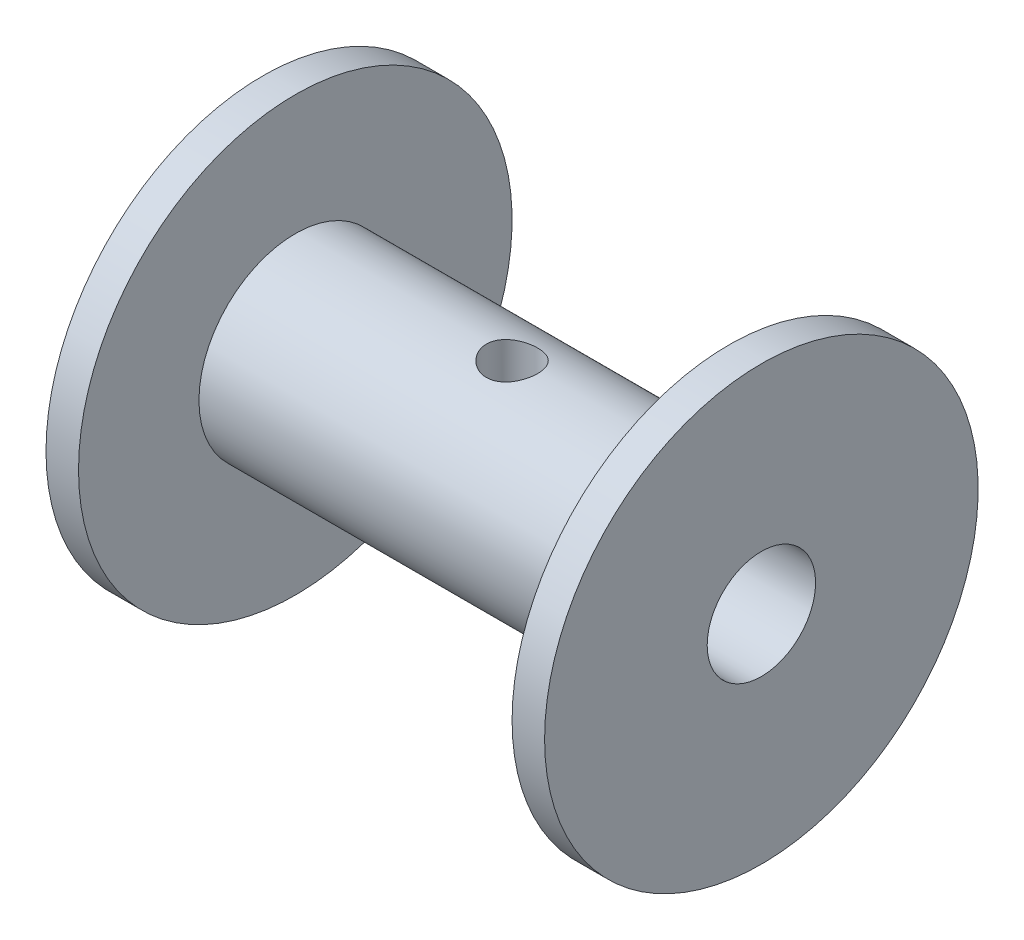
ISO-10303-21;
HEADER;
FILE_DESCRIPTION(('STEP AP214'),'2;1');
FILE_NAME('part.step','',(''),(''),'','','');
FILE_SCHEMA(('AUTOMOTIVE_DESIGN { 1 0 10303 214 1 1 1 1 }'));
ENDSEC;
DATA;
#1=APPLICATION_CONTEXT('core data for automotive mechanical design processes');
#2=APPLICATION_PROTOCOL_DEFINITION('international standard','automotive_design',2000,#1);
#3=PRODUCT_CONTEXT('',#1,'mechanical');
#4=PRODUCT('Part','Part','',(#3));
#5=PRODUCT_RELATED_PRODUCT_CATEGORY('part','',(#4));
#6=PRODUCT_DEFINITION_FORMATION('','',#4);
#7=PRODUCT_DEFINITION_CONTEXT('part definition',#1,'design');
#8=PRODUCT_DEFINITION('design','',#6,#7);
#9=PRODUCT_DEFINITION_SHAPE('','',#8);
#10=(LENGTH_UNIT() NAMED_UNIT(*) SI_UNIT(.MILLI.,.METRE.));
#11=(NAMED_UNIT(*) PLANE_ANGLE_UNIT() SI_UNIT($,.RADIAN.));
#12=(NAMED_UNIT(*) SI_UNIT($,.STERADIAN.) SOLID_ANGLE_UNIT());
#13=UNCERTAINTY_MEASURE_WITH_UNIT(LENGTH_MEASURE(1.E-05),#10,'distance_accuracy_value','');
#14=(GEOMETRIC_REPRESENTATION_CONTEXT(3) GLOBAL_UNCERTAINTY_ASSIGNED_CONTEXT((#13)) GLOBAL_UNIT_ASSIGNED_CONTEXT((#10,
#11,#12)) REPRESENTATION_CONTEXT('',''));
#15=CARTESIAN_POINT('',(0.,0.,0.));
#16=DIRECTION('',(0.,0.,1.));
#17=DIRECTION('',(1.,0.,0.));
#18=AXIS2_PLACEMENT_3D('',#15,#16,#17);
#19=CARTESIAN_POINT('',(-15.2755244755245,0.,0.));
#20=DIRECTION('',(-1.,0.,0.));
#21=DIRECTION('',(0.,0.,1.));
#22=AXIS2_PLACEMENT_3D('',#19,#20,#21);
#23=CYLINDRICAL_SURFACE('',#22,3.175);
#24=CARTESIAN_POINT('',(14.605,0.,0.));
#25=DIRECTION('',(-1.,0.,0.));
#26=DIRECTION('',(0.,0.,1.));
#27=AXIS2_PLACEMENT_3D('',#24,#25,#26);
#28=CIRCLE('',#27,3.175);
#29=CARTESIAN_POINT('',(14.605,0.,3.175));
#30=VERTEX_POINT('',#29);
#31=EDGE_CURVE('E78',#30,#30,#28,.T.);
#32=ORIENTED_EDGE('',*,*,#31,.F.);
#33=EDGE_LOOP('',(#32));
#34=FACE_BOUND('',#33,.T.);
#35=CARTESIAN_POINT('',(-14.605,0.,0.));
#36=DIRECTION('',(-1.,0.,0.));
#37=DIRECTION('',(0.,0.,1.));
#38=AXIS2_PLACEMENT_3D('',#35,#36,#37);
#39=CIRCLE('',#38,3.175);
#40=CARTESIAN_POINT('',(-14.605,0.,3.175));
#41=VERTEX_POINT('',#40);
#42=EDGE_CURVE('E72',#41,#41,#39,.T.);
#43=ORIENTED_EDGE('',*,*,#42,.T.);
#44=EDGE_LOOP('',(#43));
#45=FACE_BOUND('',#44,.T.);
#46=CARTESIAN_POINT('',(0.,2.7983253920872,-1.5));
#47=CARTESIAN_POINT('',(0.0788107476010318,2.79833097649977,-1.49999523547047));
#48=CARTESIAN_POINT('',(0.157735612205732,2.80170427159323,-1.49374832449328));
#49=CARTESIAN_POINT('',(0.313214667514685,2.81472644561665,-1.4690554061353));
#50=CARTESIAN_POINT('',(0.389762907162895,2.82438992585351,-1.45058101361493));
#51=CARTESIAN_POINT('',(0.537952673756734,2.84863009396432,-1.40237253355636));
#52=CARTESIAN_POINT('',(0.609616136431819,2.86318279906116,-1.37269332197988));
#53=CARTESIAN_POINT('',(0.74692939284759,2.89552502377023,-1.30308399064542));
#54=CARTESIAN_POINT('',(0.812579442278901,2.91331440566267,-1.26315430701281));
#55=CARTESIAN_POINT('',(0.941323245258399,2.95172227722859,-1.1707430871524));
#56=CARTESIAN_POINT('',(1.00387788849068,2.97245254188493,-1.11755658650795));
#57=CARTESIAN_POINT('',(1.11959143684936,3.01349951044786,-1.00161259672221));
#58=CARTESIAN_POINT('',(1.17274606260041,3.03381602228766,-0.938850772491943));
#59=CARTESIAN_POINT('',(1.27118937954777,3.07317288716969,-0.801034900704513));
#60=CARTESIAN_POINT('',(1.31583450125175,3.09206866660246,-0.725476017233362));
#61=CARTESIAN_POINT('',(1.39153752206176,3.12503381595021,-0.566861686619153));
#62=CARTESIAN_POINT('',(1.42260309774527,3.13910591174128,-0.483810507023547));
#63=CARTESIAN_POINT('',(1.46819431985617,3.16003750546179,-0.318263833167131));
#64=CARTESIAN_POINT('',(1.4836598006004,3.16730464125021,-0.236079837596818));
#65=CARTESIAN_POINT('',(1.50068669846295,3.17531500926786,-0.0699854874354057));
#66=CARTESIAN_POINT('',(1.50225551712034,3.17606171435844,0.0139239243031304));
#67=CARTESIAN_POINT('',(1.49185310738046,3.1711569999128,0.174104046955922));
#68=CARTESIAN_POINT('',(1.4809263684281,3.16599910390162,0.25046092630755));
#69=CARTESIAN_POINT('',(1.44768451199485,3.15058713309443,0.400106757592314));
#70=CARTESIAN_POINT('',(1.42536854800002,3.14033267949386,0.473395481043945));
#71=CARTESIAN_POINT('',(1.36978180811971,3.11549383971164,0.616162159992471));
#72=CARTESIAN_POINT('',(1.33635400002596,3.10084769916082,0.685567785451938));
#73=CARTESIAN_POINT('',(1.25968096352203,3.06858481389696,0.817962218284119));
#74=CARTESIAN_POINT('',(1.21643213988174,3.05096698193041,0.880948663490017));
#75=CARTESIAN_POINT('',(1.11701776567009,3.01265189942243,1.00453666893054));
#76=CARTESIAN_POINT('',(1.06005736803148,2.9918200943109,1.06445784147851));
#77=CARTESIAN_POINT('',(0.93699705964444,2.95046283361779,1.17424124933889));
#78=CARTESIAN_POINT('',(0.87089145595116,2.92993757775203,1.2240971710571));
#79=CARTESIAN_POINT('',(0.727172138151077,2.89039711066438,1.31484174230845));
#80=CARTESIAN_POINT('',(0.649138941996297,2.87151577260243,1.35512986365461));
#81=CARTESIAN_POINT('',(0.48628374353103,2.83914834140001,1.42170562946273));
#82=CARTESIAN_POINT('',(0.401468219875631,2.82565717160027,1.44800645544408));
#83=CARTESIAN_POINT('',(0.234253704737597,2.80697974613979,1.48387059914899));
#84=CARTESIAN_POINT('',(0.152157558069844,2.80124227464673,1.4945499135996));
#85=CARTESIAN_POINT('',(-0.0128364544628814,2.79714234532468,1.50221328025957));
#86=CARTESIAN_POINT('',(-0.0957338532268699,2.79877582206013,1.49920488189903));
#87=CARTESIAN_POINT('',(-0.251841101180711,2.80865284380239,1.4806017347564));
#88=CARTESIAN_POINT('',(-0.325238133539681,2.81627144126264,1.46619608896935));
#89=CARTESIAN_POINT('',(-0.468463633051389,2.83637948512089,1.42690562153975));
#90=CARTESIAN_POINT('',(-0.538291075738514,2.8488703210638,1.40201781025962));
#91=CARTESIAN_POINT('',(-0.676035807524976,2.87800314814948,1.3412324594274));
#92=CARTESIAN_POINT('',(-0.743715994140067,2.89481019393091,1.30487958898417));
#93=CARTESIAN_POINT('',(-0.872389828600746,2.93050507850425,1.22260967416881));
#94=CARTESIAN_POINT('',(-0.933380117805991,2.94939395301752,1.17668785898318));
#95=CARTESIAN_POINT('',(-1.05395122429284,2.98962533435876,1.07066250220429));
#96=CARTESIAN_POINT('',(-1.11263900919066,3.0110091844446,1.00955462247668));
#97=CARTESIAN_POINT('',(-1.2191662131219,3.05197816465585,0.877952835832724));
#98=CARTESIAN_POINT('',(-1.2670031388463,3.07156288076261,0.807456777596011));
#99=CARTESIAN_POINT('',(-1.35106340432696,3.10717258491727,0.657374049291594));
#100=CARTESIAN_POINT('',(-1.38708244177874,3.12313361565429,0.577656753882325));
#101=CARTESIAN_POINT('',(-1.44486593502356,3.14922093597641,0.412327293299581));
#102=CARTESIAN_POINT('',(-1.46664154231209,3.15935178938716,0.326719797872877));
#103=CARTESIAN_POINT('',(-1.49363889435459,3.17197971044583,0.159896332874222));
#104=CARTESIAN_POINT('',(-1.50011013632642,3.17505233840112,0.0789253982840775));
#105=CARTESIAN_POINT('',(-1.49988711965684,3.17494636529876,-0.0829833461657179));
#106=CARTESIAN_POINT('',(-1.49319653511093,3.17176950877122,-0.163921158963005));
#107=CARTESIAN_POINT('',(-1.46770848023088,3.15985410378094,-0.318841842835548));
#108=CARTESIAN_POINT('',(-1.44959197491994,3.15142868675494,-0.392963167600615));
#109=CARTESIAN_POINT('',(-1.40262108547478,3.13010132928976,-0.537026434022491));
#110=CARTESIAN_POINT('',(-1.37376499240882,3.1171986764347,-0.60696770847403));
#111=CARTESIAN_POINT('',(-1.30473490189286,3.08738510301285,-0.744198443618439));
#112=CARTESIAN_POINT('',(-1.26410939390821,3.0703197298679,-0.811226286131094));
#113=CARTESIAN_POINT('',(-1.17328432091972,3.03405477724481,-0.937805412907553));
#114=CARTESIAN_POINT('',(-1.12308040855481,3.01485423033003,-0.997353281796323));
#115=CARTESIAN_POINT('',(-1.00928446778082,2.97425749382228,-1.11287613406119));
#116=CARTESIAN_POINT('',(-0.944896373173603,2.9528185885393,-1.16805442942683));
#117=CARTESIAN_POINT('',(-0.807312145748489,2.91171333700677,-1.26705651381277));
#118=CARTESIAN_POINT('',(-0.734109598744511,2.89204830000693,-1.31087196019013));
#119=CARTESIAN_POINT('',(-0.579232422210802,2.85663554941127,-1.3863737982034));
#120=CARTESIAN_POINT('',(-0.497439352525226,2.84095675906997,-1.41785130272302));
#121=CARTESIAN_POINT('',(-0.328811998329219,2.81635628214136,-1.4661232120466));
#122=CARTESIAN_POINT('',(-0.241995696672077,2.80741192483264,-1.48296690968124));
#123=CARTESIAN_POINT('',(-0.128694633247988,2.80116429672363,-1.49469268672873));
#124=CARTESIAN_POINT('',(-0.10301180774758,2.80010260103933,-1.49668048940514));
#125=CARTESIAN_POINT('',(-0.0515567295081783,2.79868221732461,-1.49933495903092));
#126=CARTESIAN_POINT('',(-0.0257844722890938,2.79832356503778,-1.50000155880871));
#127=CARTESIAN_POINT('',(0.,2.7983253920872,-1.5));
#128=B_SPLINE_CURVE_WITH_KNOTS('',3,(#46,#47,#48,#49,#50,#51,#52,#53,#54,#55,#56,#57,#58,#59,
#60,#61,#62,#63,#64,#65,#66,#67,#68,#69,#70,#71,#72,#73,#74,#75,#76,#77,#78,#79,#80,#81,#82,#83,
#84,#85,#86,#87,#88,#89,#90,#91,#92,#93,#94,#95,#96,#97,#98,#99,#100,#101,#102,#103,#104,#105,
#106,#107,#108,#109,#110,#111,#112,#113,#114,#115,#116,#117,#118,#119,#120,#121,#122,#123,#124,
#125,#126,#127),.UNSPECIFIED.,.T.,.F.,(4,2,2,2,2,2,2,2,2,2,2,2,2,2,2,2,2,2,2,2,2,2,2,2,2,2,2,2,
2,2,2,2,2,2,2,2,2,2,2,2,4),(0.,0.236323871838544,0.473198284289303,0.7089273373807,
0.944646362603917,1.19762429635865,1.45071710395355,1.71864285343499,1.98641694681216,
2.23687152724757,2.48719270436037,2.71802817018661,2.94888079555675,3.18314531005561,
3.41749572162706,3.67216706074964,3.92699765369088,4.19506898546716,4.4628872392048,
4.71043828617548,4.95785281342715,5.18239796950746,5.40700721193729,5.64198832122139,
5.87708686716683,6.13804637958085,6.39906579463174,6.66438519401193,6.92949661955738,
7.17207877892644,7.41459323161728,7.64386670961211,7.87317668624822,8.11282240294707,
8.3525771477832,8.61378861881716,8.87519133270405,9.14084608292566,9.40560248746477,
9.48291651801969,9.56023447921351),.UNSPECIFIED.);
#129=CARTESIAN_POINT('',(0.,2.7983253920872,-1.5));
#130=VERTEX_POINT('',#129);
#131=EDGE_CURVE('E98',#130,#130,#128,.T.);
#132=ORIENTED_EDGE('',*,*,#131,.F.);
#133=EDGE_LOOP('',(#132));
#134=FACE_BOUND('',#133,.T.);
#135=ADVANCED_FACE('F53',(#34,#45,#134),#23,.F.);
#136=CARTESIAN_POINT('',(-15.2755244755245,0.,0.));
#137=DIRECTION('',(-1.,0.,0.));
#138=DIRECTION('',(0.,0.,1.));
#139=AXIS2_PLACEMENT_3D('',#136,#137,#138);
#140=CYLINDRICAL_SURFACE('',#139,5.64515);
#141=CARTESIAN_POINT('',(-12.7,0.,0.));
#142=DIRECTION('',(-1.,0.,0.));
#143=DIRECTION('',(0.,0.,1.));
#144=AXIS2_PLACEMENT_3D('',#141,#142,#143);
#145=CIRCLE('',#144,5.64515);
#146=CARTESIAN_POINT('',(-12.7,0.,5.64515));
#147=VERTEX_POINT('',#146);
#148=EDGE_CURVE('E94',#147,#147,#145,.T.);
#149=ORIENTED_EDGE('',*,*,#148,.F.);
#150=EDGE_LOOP('',(#149));
#151=FACE_BOUND('',#150,.T.);
#152=CARTESIAN_POINT('',(12.7,0.,0.));
#153=DIRECTION('',(-1.,0.,0.));
#154=DIRECTION('',(0.,0.,1.));
#155=AXIS2_PLACEMENT_3D('',#152,#153,#154);
#156=CIRCLE('',#155,5.64515);
#157=CARTESIAN_POINT('',(12.7,0.,5.64515));
#158=VERTEX_POINT('',#157);
#159=EDGE_CURVE('E90',#158,#158,#156,.T.);
#160=ORIENTED_EDGE('',*,*,#159,.T.);
#161=EDGE_LOOP('',(#160));
#162=FACE_BOUND('',#161,.T.);
#163=CARTESIAN_POINT('',(0.,5.44221632448583,-1.5));
#164=CARTESIAN_POINT('',(0.0826436498905731,5.44221776734982,-1.49999798482397));
#165=CARTESIAN_POINT('',(0.16530868542223,5.44411939956257,-1.49314675929322));
#166=CARTESIAN_POINT('',(0.328252175478541,5.45149790283637,-1.46597434045337));
#167=CARTESIAN_POINT('',(0.40852940000449,5.45697658425119,-1.4456463264267));
#168=CARTESIAN_POINT('',(0.564316549846696,5.47084585840447,-1.39223506110244));
#169=CARTESIAN_POINT('',(0.639832974686705,5.4792323749097,-1.35916965804295));
#170=CARTESIAN_POINT('',(0.784258298044925,5.49796717883473,-1.28127804023893));
#171=CARTESIAN_POINT('',(0.853166696174541,5.50831561464326,-1.23645093580583));
#172=CARTESIAN_POINT('',(0.984131351122835,5.53009622169304,-1.13511800376794));
#173=CARTESIAN_POINT('',(1.045999199762,5.54154749766791,-1.0783727299323));
#174=CARTESIAN_POINT('',(1.15946134412678,5.56407856754538,-0.955329261397279));
#175=CARTESIAN_POINT('',(1.21105458106165,5.57515832306535,-0.889030083387622));
#176=CARTESIAN_POINT('',(1.30328774666803,5.59591104111497,-0.747455285881687));
#177=CARTESIAN_POINT('',(1.34374049853005,5.6055588379263,-0.672053715192327));
#178=CARTESIAN_POINT('',(1.41132390215023,5.62214145846994,-0.515220536696469));
#179=CARTESIAN_POINT('',(1.43845678369634,5.62907673624688,-0.433789940796048));
#180=CARTESIAN_POINT('',(1.47802084117912,5.63931781333287,-0.269176674072654));
#181=CARTESIAN_POINT('',(1.4907724800169,5.64270260418738,-0.186076025421636));
#182=CARTESIAN_POINT('',(1.50222017877792,5.64573746281875,-0.0188506571242277));
#183=CARTESIAN_POINT('',(1.50091857507756,5.6453881513968,0.0652738899743704));
#184=CARTESIAN_POINT('',(1.48452268941679,5.64105209399141,0.229928980435986));
#185=CARTESIAN_POINT('',(1.46977462197647,5.63715665623427,0.310496770097809));
#186=CARTESIAN_POINT('',(1.42746360991348,5.62627370326876,0.46797007430665));
#187=CARTESIAN_POINT('',(1.39989993721051,5.61928601238435,0.544875380506924));
#188=CARTESIAN_POINT('',(1.33247392627963,5.60286801449619,0.69372614519827));
#189=CARTESIAN_POINT('',(1.29249269629158,5.5934142425149,0.765615053879316));
#190=CARTESIAN_POINT('',(1.20145768524585,5.57308308647157,0.901781568257522));
#191=CARTESIAN_POINT('',(1.15040175929234,5.56220542679961,0.966057695813074));
#192=CARTESIAN_POINT('',(1.03682773330209,5.53981441387915,1.08724045508485));
#193=CARTESIAN_POINT('',(0.974007640829174,5.52829179055745,1.14386267184279));
#194=CARTESIAN_POINT('',(0.839644289069423,5.50620898724192,1.2458374510173));
#195=CARTESIAN_POINT('',(0.768100506093186,5.49564886509427,1.29118933637081));
#196=CARTESIAN_POINT('',(0.617707356422072,5.47664977453883,1.36955056186863));
#197=CARTESIAN_POINT('',(0.538816186462395,5.46822410361388,1.40248312266783));
#198=CARTESIAN_POINT('',(0.376337254846516,5.45461343650754,1.45452478437216));
#199=CARTESIAN_POINT('',(0.292750653817779,5.44942764329396,1.47363728528923));
#200=CARTESIAN_POINT('',(0.125912172177079,5.44305353995125,1.49700705991464));
#201=CARTESIAN_POINT('',(0.0427239810357133,5.44175115881421,1.50168837778865));
#202=CARTESIAN_POINT('',(-0.123246457772399,5.44297933834186,1.4972307826834));
#203=CARTESIAN_POINT('',(-0.206028747366462,5.44550949438728,1.48809332861816));
#204=CARTESIAN_POINT('',(-0.36720713532357,5.4540075322859,1.45663127836107));
#205=CARTESIAN_POINT('',(-0.445656740300896,5.45990903142662,1.43456112068596));
#206=CARTESIAN_POINT('',(-0.597740886982623,5.47442006116055,1.37814600803546));
#207=CARTESIAN_POINT('',(-0.671374801748042,5.48302994350498,1.34379945858488));
#208=CARTESIAN_POINT('',(-0.813512813620182,5.50222211118877,1.26294408640984));
#209=CARTESIAN_POINT('',(-0.881869725769597,5.51284337226438,1.21618598741617));
#210=CARTESIAN_POINT('',(-1.00992272855403,5.53476961780604,1.11214416757659));
#211=CARTESIAN_POINT('',(-1.06961719942342,5.54607472958491,1.05485848273389));
#212=CARTESIAN_POINT('',(-1.18040859389798,5.56848722620232,0.929427134768068));
#213=CARTESIAN_POINT('',(-1.23120994588551,5.57957964884856,0.861017194964995));
#214=CARTESIAN_POINT('',(-1.32060764860309,5.599984167669,0.716394281042796));
#215=CARTESIAN_POINT('',(-1.3592046487608,5.60929635856386,0.640181722408613));
#216=CARTESIAN_POINT('',(-1.42274469648724,5.62503122537354,0.48265320991643));
#217=CARTESIAN_POINT('',(-1.44778951135348,5.63147537138664,0.401380552524351));
#218=CARTESIAN_POINT('',(-1.48381017839642,5.64084252840109,0.235583544296044));
#219=CARTESIAN_POINT('',(-1.49478912449133,5.64376631372989,0.151059912756288));
#220=CARTESIAN_POINT('',(-1.50217372513024,5.64572704476748,-0.016077468707376));
#221=CARTESIAN_POINT('',(-1.49901309840769,5.64487967160035,-0.0986709709983083));
#222=CARTESIAN_POINT('',(-1.4792145259925,5.63965460646783,-0.262106269548188));
#223=CARTESIAN_POINT('',(-1.46257707990777,5.63527704537237,-0.342948130629297));
#224=CARTESIAN_POINT('',(-1.41654166905826,5.62350613840027,-0.500067594383634));
#225=CARTESIAN_POINT('',(-1.38723114573617,5.61613347874035,-0.57637246936201));
#226=CARTESIAN_POINT('',(-1.31675972779932,5.59914363493961,-0.723024835745981));
#227=CARTESIAN_POINT('',(-1.27559718045502,5.58952613779831,-0.793371494524247));
#228=CARTESIAN_POINT('',(-1.18131764645405,5.56875793134443,-0.928131965195985));
#229=CARTESIAN_POINT('',(-1.12791269922946,5.5575733380131,-0.992339082223206));
#230=CARTESIAN_POINT('',(-1.01121124142991,5.53506950879546,-1.1110269742205));
#231=CARTESIAN_POINT('',(-0.94791213756095,5.52375023833045,-1.16550519116753));
#232=CARTESIAN_POINT('',(-0.811559656990755,5.50197482997724,-1.2643635861029));
#233=CARTESIAN_POINT('',(-0.738323782610977,5.49154287549226,-1.30849784931156));
#234=CARTESIAN_POINT('',(-0.585203332164705,5.47306373496142,-1.38376439419231));
#235=CARTESIAN_POINT('',(-0.505323175756263,5.46501497964844,-1.41490523720545));
#236=CARTESIAN_POINT('',(-0.354773607905722,5.45333936032317,-1.45919130067615));
#237=CARTESIAN_POINT('',(-0.284760932617647,5.44920182935005,-1.47445878618925));
#238=CARTESIAN_POINT('',(-0.143170736948714,5.44363983861492,-1.49486344059047));
#239=CARTESIAN_POINT('',(-0.0715933929966919,5.44221507454673,-1.50000174572747));
#240=CARTESIAN_POINT('',(0.,5.44221632448583,-1.5));
#241=B_SPLINE_CURVE_WITH_KNOTS('',3,(#163,#164,#165,#166,#167,#168,#169,#170,#171,#172,#173,
#174,#175,#176,#177,#178,#179,#180,#181,#182,#183,#184,#185,#186,#187,#188,#189,#190,#191,#192,
#193,#194,#195,#196,#197,#198,#199,#200,#201,#202,#203,#204,#205,#206,#207,#208,#209,#210,#211,
#212,#213,#214,#215,#216,#217,#218,#219,#220,#221,#222,#223,#224,#225,#226,#227,#228,#229,#230,
#231,#232,#233,#234,#235,#236,#237,#238,#239,#240),.UNSPECIFIED.,.T.,.F.,(4,2,2,2,2,2,2,2,2,2,2,
2,2,2,2,2,2,2,2,2,2,2,2,2,2,2,2,2,2,2,2,2,2,2,2,2,2,2,4),(0.,0.247667710125486,
0.495460862778318,0.742908051487608,0.990373963205123,1.24339169248411,1.4964354815667,
1.75350218310325,2.01052583618261,2.26170139841543,2.51283520291044,2.75768007782892,
3.00253886457703,3.24981834681255,3.49714576382274,3.75201343494891,4.00689641350378,
4.26333027004575,4.51970101723072,4.76846310534649,5.01719893228946,5.26119804243582,
5.50522885505554,5.75459010240262,6.00399791719429,6.26055652250194,6.51710147331073,
6.77169223310905,7.02622698369015,7.27300855695849,7.51978098204571,7.76487724343747,
8.010007699341,8.26163597667072,8.51333031761168,8.77050932101105,9.02751860100832,
9.24209480975804,9.45664694688028),.UNSPECIFIED.);
#242=CARTESIAN_POINT('',(0.,5.44221632448583,-1.5));
#243=VERTEX_POINT('',#242);
#244=EDGE_CURVE('E57',#243,#243,#241,.T.);
#245=ORIENTED_EDGE('',*,*,#244,.T.);
#246=EDGE_LOOP('',(#245));
#247=FACE_BOUND('',#246,.T.);
#248=ADVANCED_FACE('F113',(#151,#162,#247),#140,.T.);
#249=CARTESIAN_POINT('',(-12.7,0.,0.));
#250=DIRECTION('',(1.,0.,0.));
#251=DIRECTION('',(0.,0.,-1.));
#252=AXIS2_PLACEMENT_3D('',#249,#250,#251);
#253=PLANE('',#252);
#254=ORIENTED_EDGE('',*,*,#148,.T.);
#255=EDGE_LOOP('',(#254));
#256=FACE_BOUND('',#255,.T.);
#257=CARTESIAN_POINT('',(-12.7,0.,0.));
#258=DIRECTION('',(-1.,0.,0.));
#259=DIRECTION('',(0.,0.,1.));
#260=AXIS2_PLACEMENT_3D('',#257,#258,#259);
#261=CIRCLE('',#260,12.7);
#262=CARTESIAN_POINT('',(-12.7,0.,12.7));
#263=VERTEX_POINT('',#262);
#264=EDGE_CURVE('E10',#263,#263,#261,.T.);
#265=ORIENTED_EDGE('',*,*,#264,.F.);
#266=EDGE_LOOP('',(#265));
#267=FACE_BOUND('',#266,.T.);
#268=ADVANCED_FACE('F55',(#256,#267),#253,.T.);
#269=CARTESIAN_POINT('',(-15.2755244755245,0.,0.));
#270=DIRECTION('',(-1.,0.,0.));
#271=DIRECTION('',(0.,0.,1.));
#272=AXIS2_PLACEMENT_3D('',#269,#270,#271);
#273=CYLINDRICAL_SURFACE('',#272,12.7);
#274=ORIENTED_EDGE('',*,*,#264,.T.);
#275=EDGE_LOOP('',(#274));
#276=FACE_BOUND('',#275,.T.);
#277=CARTESIAN_POINT('',(-14.605,0.,0.));
#278=DIRECTION('',(-1.,0.,0.));
#279=DIRECTION('',(0.,0.,1.));
#280=AXIS2_PLACEMENT_3D('',#277,#278,#279);
#281=CIRCLE('',#280,12.7);
#282=CARTESIAN_POINT('',(-14.605,0.,12.7));
#283=VERTEX_POINT('',#282);
#284=EDGE_CURVE('E67',#283,#283,#281,.T.);
#285=ORIENTED_EDGE('',*,*,#284,.F.);
#286=EDGE_LOOP('',(#285));
#287=FACE_BOUND('',#286,.T.);
#288=ADVANCED_FACE('F132',(#276,#287),#273,.T.);
#289=CARTESIAN_POINT('',(-14.605,0.,0.));
#290=DIRECTION('',(1.,0.,0.));
#291=DIRECTION('',(0.,0.,-1.));
#292=AXIS2_PLACEMENT_3D('',#289,#290,#291);
#293=PLANE('',#292);
#294=ORIENTED_EDGE('',*,*,#42,.F.);
#295=EDGE_LOOP('',(#294));
#296=FACE_BOUND('',#295,.T.);
#297=ORIENTED_EDGE('',*,*,#284,.T.);
#298=EDGE_LOOP('',(#297));
#299=FACE_BOUND('',#298,.T.);
#300=ADVANCED_FACE('F127',(#296,#299),#293,.F.);
#301=CARTESIAN_POINT('',(14.605,0.,0.));
#302=DIRECTION('',(1.,0.,0.));
#303=DIRECTION('',(0.,0.,-1.));
#304=AXIS2_PLACEMENT_3D('',#301,#302,#303);
#305=PLANE('',#304);
#306=ORIENTED_EDGE('',*,*,#31,.T.);
#307=EDGE_LOOP('',(#306));
#308=FACE_BOUND('',#307,.T.);
#309=CARTESIAN_POINT('',(14.605,0.,0.));
#310=DIRECTION('',(-1.,0.,0.));
#311=DIRECTION('',(0.,0.,1.));
#312=AXIS2_PLACEMENT_3D('',#309,#310,#311);
#313=CIRCLE('',#312,12.7);
#314=CARTESIAN_POINT('',(14.605,0.,12.7));
#315=VERTEX_POINT('',#314);
#316=EDGE_CURVE('E82',#315,#315,#313,.T.);
#317=ORIENTED_EDGE('',*,*,#316,.F.);
#318=EDGE_LOOP('',(#317));
#319=FACE_BOUND('',#318,.T.);
#320=ADVANCED_FACE('F124',(#308,#319),#305,.T.);
#321=CARTESIAN_POINT('',(-15.2755244755245,0.,0.));
#322=DIRECTION('',(-1.,0.,0.));
#323=DIRECTION('',(0.,0.,1.));
#324=AXIS2_PLACEMENT_3D('',#321,#322,#323);
#325=CYLINDRICAL_SURFACE('',#324,12.7);
#326=CARTESIAN_POINT('',(12.7,0.,0.));
#327=DIRECTION('',(-1.,0.,0.));
#328=DIRECTION('',(0.,0.,1.));
#329=AXIS2_PLACEMENT_3D('',#326,#327,#328);
#330=CIRCLE('',#329,12.7);
#331=CARTESIAN_POINT('',(12.7,0.,12.7));
#332=VERTEX_POINT('',#331);
#333=EDGE_CURVE('E86',#332,#332,#330,.T.);
#334=ORIENTED_EDGE('',*,*,#333,.F.);
#335=EDGE_LOOP('',(#334));
#336=FACE_BOUND('',#335,.T.);
#337=ORIENTED_EDGE('',*,*,#316,.T.);
#338=EDGE_LOOP('',(#337));
#339=FACE_BOUND('',#338,.T.);
#340=ADVANCED_FACE('F121',(#336,#339),#325,.T.);
#341=CARTESIAN_POINT('',(12.7,0.,0.));
#342=DIRECTION('',(1.,0.,0.));
#343=DIRECTION('',(0.,0.,-1.));
#344=AXIS2_PLACEMENT_3D('',#341,#342,#343);
#345=PLANE('',#344);
#346=ORIENTED_EDGE('',*,*,#159,.F.);
#347=EDGE_LOOP('',(#346));
#348=FACE_BOUND('',#347,.T.);
#349=ORIENTED_EDGE('',*,*,#333,.T.);
#350=EDGE_LOOP('',(#349));
#351=FACE_BOUND('',#350,.T.);
#352=ADVANCED_FACE('F111',(#348,#351),#345,.F.);
#353=CARTESIAN_POINT('',(0.,12.7,0.));
#354=DIRECTION('',(0.,-1.,0.));
#355=DIRECTION('',(0.,0.,-1.));
#356=AXIS2_PLACEMENT_3D('',#353,#354,#355);
#357=CYLINDRICAL_SURFACE('',#356,1.5);
#358=ORIENTED_EDGE('',*,*,#244,.F.);
#359=EDGE_LOOP('',(#358));
#360=FACE_BOUND('',#359,.T.);
#361=ORIENTED_EDGE('',*,*,#131,.T.);
#362=EDGE_LOOP('',(#361));
#363=FACE_BOUND('',#362,.T.);
#364=ADVANCED_FACE('F108',(#360,#363),#357,.F.);
#365=CLOSED_SHELL('',(#135,#248,#268,#288,#300,#320,#340,#352,#364));
#366=MANIFOLD_SOLID_BREP('B2',#365);
#367=ADVANCED_BREP_SHAPE_REPRESENTATION('',(#18,#366),#14);
#368=SHAPE_DEFINITION_REPRESENTATION(#9,#367);
ENDSEC;
END-ISO-10303-21;
